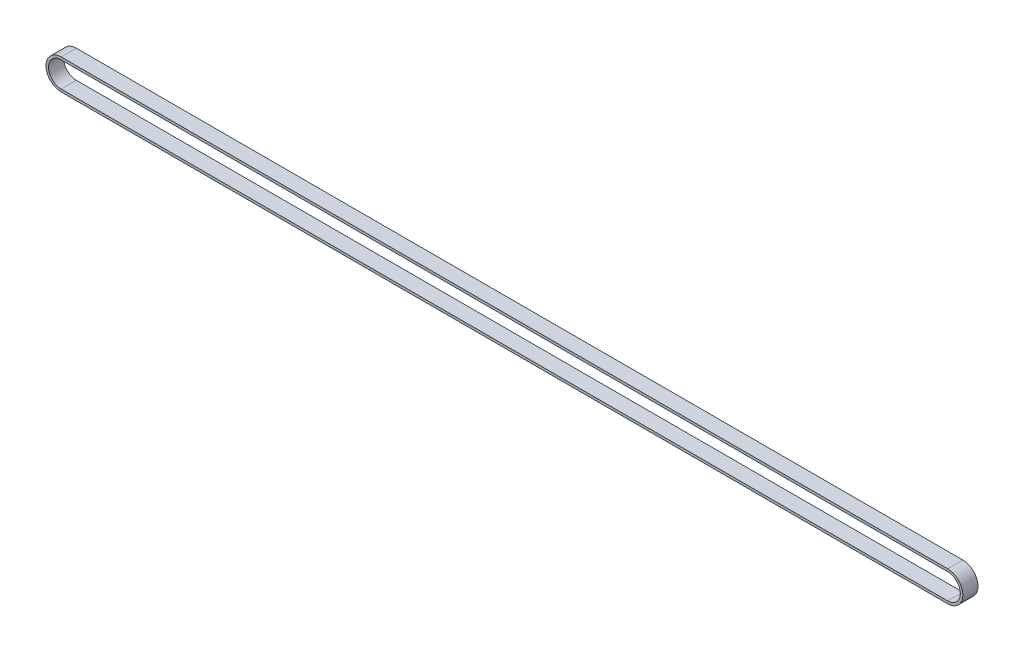
ISO-10303-21;
HEADER;
FILE_DESCRIPTION(('STEP AP214'),'2;1');
FILE_NAME('part.step','',(''),(''),'','','');
FILE_SCHEMA(('AUTOMOTIVE_DESIGN { 1 0 10303 214 1 1 1 1 }'));
ENDSEC;
DATA;
#1=APPLICATION_CONTEXT('core data for automotive mechanical design processes');
#2=APPLICATION_PROTOCOL_DEFINITION('international standard','automotive_design',2000,#1);
#3=PRODUCT_CONTEXT('',#1,'mechanical');
#4=PRODUCT('Part','Part','',(#3));
#5=PRODUCT_RELATED_PRODUCT_CATEGORY('part','',(#4));
#6=PRODUCT_DEFINITION_FORMATION('','',#4);
#7=PRODUCT_DEFINITION_CONTEXT('part definition',#1,'design');
#8=PRODUCT_DEFINITION('design','',#6,#7);
#9=PRODUCT_DEFINITION_SHAPE('','',#8);
#10=(LENGTH_UNIT() NAMED_UNIT(*) SI_UNIT(.MILLI.,.METRE.));
#11=(NAMED_UNIT(*) PLANE_ANGLE_UNIT() SI_UNIT($,.RADIAN.));
#12=(NAMED_UNIT(*) SI_UNIT($,.STERADIAN.) SOLID_ANGLE_UNIT());
#13=UNCERTAINTY_MEASURE_WITH_UNIT(LENGTH_MEASURE(1.E-05),#10,'distance_accuracy_value','');
#14=(GEOMETRIC_REPRESENTATION_CONTEXT(3) GLOBAL_UNCERTAINTY_ASSIGNED_CONTEXT((#13)) GLOBAL_UNIT_ASSIGNED_CONTEXT((#10,
#11,#12)) REPRESENTATION_CONTEXT('',''));
#15=CARTESIAN_POINT('',(0.,0.,0.));
#16=DIRECTION('',(0.,0.,1.));
#17=DIRECTION('',(1.,0.,0.));
#18=AXIS2_PLACEMENT_3D('',#15,#16,#17);
#19=CARTESIAN_POINT('',(0.,0.,6.));
#20=DIRECTION('',(0.,0.,1.));
#21=DIRECTION('',(1.,0.,0.));
#22=AXIS2_PLACEMENT_3D('',#19,#20,#21);
#23=PLANE('',#22);
#24=CARTESIAN_POINT('',(0.,0.,6.));
#25=DIRECTION('',(0.,0.,1.));
#26=DIRECTION('',(1.,0.,0.));
#27=AXIS2_PLACEMENT_3D('',#24,#25,#26);
#28=CIRCLE('',#27,6.);
#29=CARTESIAN_POINT('',(0.,6.,6.));
#30=VERTEX_POINT('',#29);
#31=CARTESIAN_POINT('',(0.,-6.,6.));
#32=VERTEX_POINT('',#31);
#33=EDGE_CURVE('E136',#30,#32,#28,.T.);
#34=ORIENTED_EDGE('',*,*,#33,.T.);
#35=DIRECTION('',(1.,0.,0.));
#36=VECTOR('',#35,1.);
#37=CARTESIAN_POINT('',(0.,-6.,6.));
#38=LINE('',#37,#36);
#39=CARTESIAN_POINT('',(350.7,-6.,6.));
#40=VERTEX_POINT('',#39);
#41=EDGE_CURVE('E139',#32,#40,#38,.T.);
#42=ORIENTED_EDGE('',*,*,#41,.T.);
#43=CARTESIAN_POINT('',(350.7,0.,6.));
#44=DIRECTION('',(0.,0.,1.));
#45=DIRECTION('',(1.,0.,0.));
#46=AXIS2_PLACEMENT_3D('',#43,#44,#45);
#47=CIRCLE('',#46,6.);
#48=CARTESIAN_POINT('',(350.7,6.,6.));
#49=VERTEX_POINT('',#48);
#50=EDGE_CURVE('E142',#40,#49,#47,.T.);
#51=ORIENTED_EDGE('',*,*,#50,.T.);
#52=DIRECTION('',(-1.,0.,0.));
#53=VECTOR('',#52,1.);
#54=CARTESIAN_POINT('',(0.,6.,6.));
#55=LINE('',#54,#53);
#56=EDGE_CURVE('E144',#49,#30,#55,.T.);
#57=ORIENTED_EDGE('',*,*,#56,.T.);
#58=EDGE_LOOP('',(#34,#42,#51,#57));
#59=FACE_BOUND('',#58,.T.);
#60=DIRECTION('',(1.,0.,0.));
#61=VECTOR('',#60,1.);
#62=CARTESIAN_POINT('',(0.,-5.,6.));
#63=LINE('',#62,#61);
#64=CARTESIAN_POINT('',(0.,-5.,6.));
#65=VERTEX_POINT('',#64);
#66=CARTESIAN_POINT('',(350.7,-5.,6.));
#67=VERTEX_POINT('',#66);
#68=EDGE_CURVE('E108',#65,#67,#63,.T.);
#69=ORIENTED_EDGE('',*,*,#68,.F.);
#70=CARTESIAN_POINT('',(0.,0.,6.));
#71=DIRECTION('',(0.,0.,1.));
#72=DIRECTION('',(1.,0.,0.));
#73=AXIS2_PLACEMENT_3D('',#70,#71,#72);
#74=CIRCLE('',#73,5.);
#75=CARTESIAN_POINT('',(0.,5.,6.));
#76=VERTEX_POINT('',#75);
#77=EDGE_CURVE('E100',#76,#65,#74,.T.);
#78=ORIENTED_EDGE('',*,*,#77,.F.);
#79=DIRECTION('',(-1.,0.,0.));
#80=VECTOR('',#79,1.);
#81=CARTESIAN_POINT('',(0.,5.,6.));
#82=LINE('',#81,#80);
#83=CARTESIAN_POINT('',(350.7,5.,6.));
#84=VERTEX_POINT('',#83);
#85=EDGE_CURVE('E122',#84,#76,#82,.T.);
#86=ORIENTED_EDGE('',*,*,#85,.F.);
#87=CARTESIAN_POINT('',(350.7,0.,6.));
#88=DIRECTION('',(0.,0.,1.));
#89=DIRECTION('',(1.,0.,0.));
#90=AXIS2_PLACEMENT_3D('',#87,#88,#89);
#91=CIRCLE('',#90,5.);
#92=EDGE_CURVE('E120',#67,#84,#91,.T.);
#93=ORIENTED_EDGE('',*,*,#92,.F.);
#94=EDGE_LOOP('',(#69,#78,#86,#93));
#95=FACE_BOUND('',#94,.T.);
#96=ADVANCED_FACE('F35',(#59,#95),#23,.T.);
#97=CARTESIAN_POINT('',(0.,0.,0.));
#98=DIRECTION('',(0.,0.,1.));
#99=DIRECTION('',(1.,0.,0.));
#100=AXIS2_PLACEMENT_3D('',#97,#98,#99);
#101=PLANE('',#100);
#102=CARTESIAN_POINT('',(0.,0.,0.));
#103=DIRECTION('',(0.,0.,1.));
#104=DIRECTION('',(1.,0.,0.));
#105=AXIS2_PLACEMENT_3D('',#102,#103,#104);
#106=CIRCLE('',#105,6.);
#107=CARTESIAN_POINT('',(0.,6.,0.));
#108=VERTEX_POINT('',#107);
#109=CARTESIAN_POINT('',(0.,-6.,0.));
#110=VERTEX_POINT('',#109);
#111=EDGE_CURVE('E116',#108,#110,#106,.T.);
#112=ORIENTED_EDGE('',*,*,#111,.F.);
#113=DIRECTION('',(-1.,0.,0.));
#114=VECTOR('',#113,1.);
#115=CARTESIAN_POINT('',(0.,6.,0.));
#116=LINE('',#115,#114);
#117=CARTESIAN_POINT('',(350.7,6.,0.));
#118=VERTEX_POINT('',#117);
#119=EDGE_CURVE('E140',#118,#108,#116,.T.);
#120=ORIENTED_EDGE('',*,*,#119,.F.);
#121=CARTESIAN_POINT('',(350.7,0.,0.));
#122=DIRECTION('',(0.,0.,1.));
#123=DIRECTION('',(1.,0.,0.));
#124=AXIS2_PLACEMENT_3D('',#121,#122,#123);
#125=CIRCLE('',#124,6.);
#126=CARTESIAN_POINT('',(350.7,-6.,0.));
#127=VERTEX_POINT('',#126);
#128=EDGE_CURVE('E151',#127,#118,#125,.T.);
#129=ORIENTED_EDGE('',*,*,#128,.F.);
#130=DIRECTION('',(1.,0.,0.));
#131=VECTOR('',#130,1.);
#132=CARTESIAN_POINT('',(0.,-6.,0.));
#133=LINE('',#132,#131);
#134=EDGE_CURVE('E149',#110,#127,#133,.T.);
#135=ORIENTED_EDGE('',*,*,#134,.F.);
#136=EDGE_LOOP('',(#112,#120,#129,#135));
#137=FACE_BOUND('',#136,.T.);
#138=CARTESIAN_POINT('',(0.,0.,0.));
#139=DIRECTION('',(0.,0.,1.));
#140=DIRECTION('',(1.,0.,0.));
#141=AXIS2_PLACEMENT_3D('',#138,#139,#140);
#142=CIRCLE('',#141,5.);
#143=CARTESIAN_POINT('',(0.,5.,0.));
#144=VERTEX_POINT('',#143);
#145=CARTESIAN_POINT('',(0.,-5.,0.));
#146=VERTEX_POINT('',#145);
#147=EDGE_CURVE('E58',#144,#146,#142,.T.);
#148=ORIENTED_EDGE('',*,*,#147,.T.);
#149=DIRECTION('',(1.,0.,0.));
#150=VECTOR('',#149,1.);
#151=CARTESIAN_POINT('',(0.,-5.,0.));
#152=LINE('',#151,#150);
#153=CARTESIAN_POINT('',(350.7,-5.,0.));
#154=VERTEX_POINT('',#153);
#155=EDGE_CURVE('E115',#146,#154,#152,.T.);
#156=ORIENTED_EDGE('',*,*,#155,.T.);
#157=CARTESIAN_POINT('',(350.7,0.,0.));
#158=DIRECTION('',(0.,0.,1.));
#159=DIRECTION('',(1.,0.,0.));
#160=AXIS2_PLACEMENT_3D('',#157,#158,#159);
#161=CIRCLE('',#160,5.);
#162=CARTESIAN_POINT('',(350.7,5.,0.));
#163=VERTEX_POINT('',#162);
#164=EDGE_CURVE('E128',#154,#163,#161,.T.);
#165=ORIENTED_EDGE('',*,*,#164,.T.);
#166=DIRECTION('',(-1.,0.,0.));
#167=VECTOR('',#166,1.);
#168=CARTESIAN_POINT('',(0.,5.,0.));
#169=LINE('',#168,#167);
#170=EDGE_CURVE('E109',#163,#144,#169,.T.);
#171=ORIENTED_EDGE('',*,*,#170,.T.);
#172=EDGE_LOOP('',(#148,#156,#165,#171));
#173=FACE_BOUND('',#172,.T.);
#174=ADVANCED_FACE('F169',(#137,#173),#101,.F.);
#175=CARTESIAN_POINT('',(0.,0.,6.));
#176=DIRECTION('',(0.,0.,-1.));
#177=DIRECTION('',(-1.,0.,0.));
#178=AXIS2_PLACEMENT_3D('',#175,#176,#177);
#179=CYLINDRICAL_SURFACE('',#178,6.);
#180=ORIENTED_EDGE('',*,*,#111,.T.);
#181=DIRECTION('',(0.,0.,-1.));
#182=VECTOR('',#181,1.);
#183=CARTESIAN_POINT('',(0.,-6.,6.));
#184=LINE('',#183,#182);
#185=EDGE_CURVE('E11',#32,#110,#184,.T.);
#186=ORIENTED_EDGE('',*,*,#185,.F.);
#187=ORIENTED_EDGE('',*,*,#33,.F.);
#188=DIRECTION('',(0.,0.,-1.));
#189=VECTOR('',#188,1.);
#190=CARTESIAN_POINT('',(0.,6.,6.));
#191=LINE('',#190,#189);
#192=EDGE_CURVE('E146',#30,#108,#191,.T.);
#193=ORIENTED_EDGE('',*,*,#192,.T.);
#194=EDGE_LOOP('',(#180,#186,#187,#193));
#195=FACE_BOUND('',#194,.T.);
#196=ADVANCED_FACE('F37',(#195),#179,.T.);
#197=CARTESIAN_POINT('',(0.,-6.,6.));
#198=DIRECTION('',(0.,1.,0.));
#199=DIRECTION('',(0.,0.,1.));
#200=AXIS2_PLACEMENT_3D('',#197,#198,#199);
#201=PLANE('',#200);
#202=ORIENTED_EDGE('',*,*,#134,.T.);
#203=DIRECTION('',(0.,0.,-1.));
#204=VECTOR('',#203,1.);
#205=CARTESIAN_POINT('',(350.7,-6.,6.));
#206=LINE('',#205,#204);
#207=EDGE_CURVE('E43',#40,#127,#206,.T.);
#208=ORIENTED_EDGE('',*,*,#207,.F.);
#209=ORIENTED_EDGE('',*,*,#41,.F.);
#210=ORIENTED_EDGE('',*,*,#185,.T.);
#211=EDGE_LOOP('',(#202,#208,#209,#210));
#212=FACE_BOUND('',#211,.T.);
#213=ADVANCED_FACE('F179',(#212),#201,.F.);
#214=CARTESIAN_POINT('',(350.7,0.,6.));
#215=DIRECTION('',(0.,0.,-1.));
#216=DIRECTION('',(-1.,0.,0.));
#217=AXIS2_PLACEMENT_3D('',#214,#215,#216);
#218=CYLINDRICAL_SURFACE('',#217,6.);
#219=ORIENTED_EDGE('',*,*,#128,.T.);
#220=DIRECTION('',(0.,0.,-1.));
#221=VECTOR('',#220,1.);
#222=CARTESIAN_POINT('',(350.7,6.,6.));
#223=LINE('',#222,#221);
#224=EDGE_CURVE('E156',#49,#118,#223,.T.);
#225=ORIENTED_EDGE('',*,*,#224,.F.);
#226=ORIENTED_EDGE('',*,*,#50,.F.);
#227=ORIENTED_EDGE('',*,*,#207,.T.);
#228=EDGE_LOOP('',(#219,#225,#226,#227));
#229=FACE_BOUND('',#228,.T.);
#230=ADVANCED_FACE('F163',(#229),#218,.T.);
#231=CARTESIAN_POINT('',(0.,6.,6.));
#232=DIRECTION('',(0.,-1.,0.));
#233=DIRECTION('',(0.,0.,-1.));
#234=AXIS2_PLACEMENT_3D('',#231,#232,#233);
#235=PLANE('',#234);
#236=ORIENTED_EDGE('',*,*,#119,.T.);
#237=ORIENTED_EDGE('',*,*,#192,.F.);
#238=ORIENTED_EDGE('',*,*,#56,.F.);
#239=ORIENTED_EDGE('',*,*,#224,.T.);
#240=EDGE_LOOP('',(#236,#237,#238,#239));
#241=FACE_BOUND('',#240,.T.);
#242=ADVANCED_FACE('F173',(#241),#235,.F.);
#243=CARTESIAN_POINT('',(0.,0.,6.));
#244=DIRECTION('',(0.,0.,-1.));
#245=DIRECTION('',(-1.,0.,0.));
#246=AXIS2_PLACEMENT_3D('',#243,#244,#245);
#247=CYLINDRICAL_SURFACE('',#246,5.);
#248=ORIENTED_EDGE('',*,*,#147,.F.);
#249=DIRECTION('',(0.,0.,-1.));
#250=VECTOR('',#249,1.);
#251=CARTESIAN_POINT('',(0.,5.,6.));
#252=LINE('',#251,#250);
#253=EDGE_CURVE('E104',#76,#144,#252,.T.);
#254=ORIENTED_EDGE('',*,*,#253,.F.);
#255=ORIENTED_EDGE('',*,*,#77,.T.);
#256=DIRECTION('',(0.,0.,-1.));
#257=VECTOR('',#256,1.);
#258=CARTESIAN_POINT('',(0.,-5.,6.));
#259=LINE('',#258,#257);
#260=EDGE_CURVE('E103',#65,#146,#259,.T.);
#261=ORIENTED_EDGE('',*,*,#260,.T.);
#262=EDGE_LOOP('',(#248,#254,#255,#261));
#263=FACE_BOUND('',#262,.T.);
#264=ADVANCED_FACE('F102',(#263),#247,.F.);
#265=CARTESIAN_POINT('',(0.,-5.,6.));
#266=DIRECTION('',(0.,1.,0.));
#267=DIRECTION('',(0.,0.,1.));
#268=AXIS2_PLACEMENT_3D('',#265,#266,#267);
#269=PLANE('',#268);
#270=ORIENTED_EDGE('',*,*,#155,.F.);
#271=ORIENTED_EDGE('',*,*,#260,.F.);
#272=ORIENTED_EDGE('',*,*,#68,.T.);
#273=DIRECTION('',(0.,0.,-1.));
#274=VECTOR('',#273,1.);
#275=CARTESIAN_POINT('',(350.7,-5.,6.));
#276=LINE('',#275,#274);
#277=EDGE_CURVE('E117',#67,#154,#276,.T.);
#278=ORIENTED_EDGE('',*,*,#277,.T.);
#279=EDGE_LOOP('',(#270,#271,#272,#278));
#280=FACE_BOUND('',#279,.T.);
#281=ADVANCED_FACE('F112',(#280),#269,.T.);
#282=CARTESIAN_POINT('',(350.7,0.,6.));
#283=DIRECTION('',(0.,0.,-1.));
#284=DIRECTION('',(-1.,0.,0.));
#285=AXIS2_PLACEMENT_3D('',#282,#283,#284);
#286=CYLINDRICAL_SURFACE('',#285,5.);
#287=ORIENTED_EDGE('',*,*,#164,.F.);
#288=ORIENTED_EDGE('',*,*,#277,.F.);
#289=ORIENTED_EDGE('',*,*,#92,.T.);
#290=DIRECTION('',(0.,0.,-1.));
#291=VECTOR('',#290,1.);
#292=CARTESIAN_POINT('',(350.7,5.,6.));
#293=LINE('',#292,#291);
#294=EDGE_CURVE('E50',#84,#163,#293,.T.);
#295=ORIENTED_EDGE('',*,*,#294,.T.);
#296=EDGE_LOOP('',(#287,#288,#289,#295));
#297=FACE_BOUND('',#296,.T.);
#298=ADVANCED_FACE('F202',(#297),#286,.F.);
#299=CARTESIAN_POINT('',(0.,5.,6.));
#300=DIRECTION('',(0.,-1.,0.));
#301=DIRECTION('',(0.,0.,-1.));
#302=AXIS2_PLACEMENT_3D('',#299,#300,#301);
#303=PLANE('',#302);
#304=ORIENTED_EDGE('',*,*,#170,.F.);
#305=ORIENTED_EDGE('',*,*,#294,.F.);
#306=ORIENTED_EDGE('',*,*,#85,.T.);
#307=ORIENTED_EDGE('',*,*,#253,.T.);
#308=EDGE_LOOP('',(#304,#305,#306,#307));
#309=FACE_BOUND('',#308,.T.);
#310=ADVANCED_FACE('F206',(#309),#303,.T.);
#311=CLOSED_SHELL('',(#96,#174,#196,#213,#230,#242,#264,#281,#298,#310));
#312=MANIFOLD_SOLID_BREP('B2',#311);
#313=ADVANCED_BREP_SHAPE_REPRESENTATION('',(#18,#312),#14);
#314=SHAPE_DEFINITION_REPRESENTATION(#9,#313);
ENDSEC;
END-ISO-10303-21;
